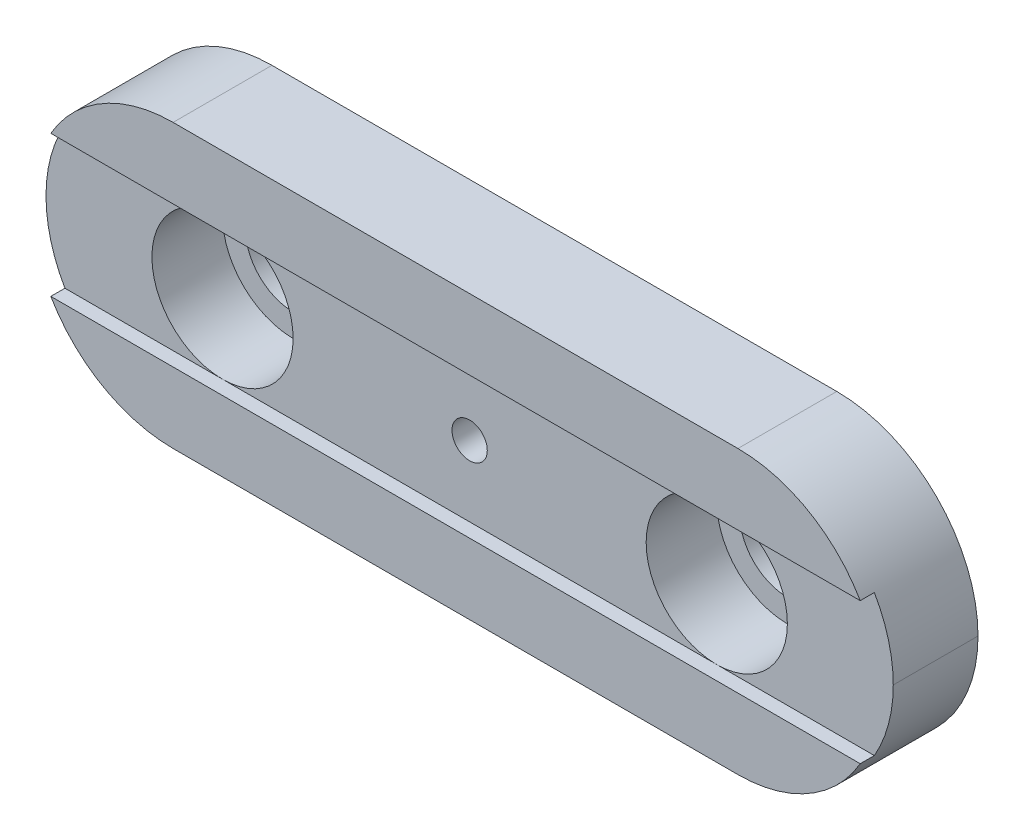
ISO-10303-21;
HEADER;
FILE_DESCRIPTION(('STEP AP214'),'2;1');
FILE_NAME('part.step','',(''),(''),'','','');
FILE_SCHEMA(('AUTOMOTIVE_DESIGN { 1 0 10303 214 1 1 1 1 }'));
ENDSEC;
DATA;
#1=APPLICATION_CONTEXT('core data for automotive mechanical design processes');
#2=APPLICATION_PROTOCOL_DEFINITION('international standard','automotive_design',2000,#1);
#3=PRODUCT_CONTEXT('',#1,'mechanical');
#4=PRODUCT('Part','Part','',(#3));
#5=PRODUCT_RELATED_PRODUCT_CATEGORY('part','',(#4));
#6=PRODUCT_DEFINITION_FORMATION('','',#4);
#7=PRODUCT_DEFINITION_CONTEXT('part definition',#1,'design');
#8=PRODUCT_DEFINITION('design','',#6,#7);
#9=PRODUCT_DEFINITION_SHAPE('','',#8);
#10=(LENGTH_UNIT() NAMED_UNIT(*) SI_UNIT(.MILLI.,.METRE.));
#11=(NAMED_UNIT(*) PLANE_ANGLE_UNIT() SI_UNIT($,.RADIAN.));
#12=(NAMED_UNIT(*) SI_UNIT($,.STERADIAN.) SOLID_ANGLE_UNIT());
#13=UNCERTAINTY_MEASURE_WITH_UNIT(LENGTH_MEASURE(1.E-05),#10,'distance_accuracy_value','');
#14=(GEOMETRIC_REPRESENTATION_CONTEXT(3) GLOBAL_UNCERTAINTY_ASSIGNED_CONTEXT((#13)) GLOBAL_UNIT_ASSIGNED_CONTEXT((#10,
#11,#12)) REPRESENTATION_CONTEXT('',''));
#15=CARTESIAN_POINT('',(0.,0.,0.));
#16=DIRECTION('',(0.,0.,1.));
#17=DIRECTION('',(1.,0.,0.));
#18=AXIS2_PLACEMENT_3D('',#15,#16,#17);
#19=CARTESIAN_POINT('',(60.,10.,12.));
#20=DIRECTION('',(0.,0.,-1.));
#21=DIRECTION('',(-1.,0.,0.));
#22=AXIS2_PLACEMENT_3D('',#19,#20,#21);
#23=PLANE('',#22);
#24=CARTESIAN_POINT('',(0.,0.,12.));
#25=DIRECTION('',(0.,0.,1.));
#26=DIRECTION('',(1.,0.,0.));
#27=AXIS2_PLACEMENT_3D('',#24,#25,#26);
#28=CIRCLE('',#27,2.49999999999999);
#29=CARTESIAN_POINT('',(2.49999999999999,0.,12.));
#30=VERTEX_POINT('',#29);
#31=EDGE_CURVE('E219',#30,#30,#28,.T.);
#32=ORIENTED_EDGE('',*,*,#31,.F.);
#33=EDGE_LOOP('',(#32));
#34=FACE_BOUND('',#33,.T.);
#35=CARTESIAN_POINT('',(-35.,0.,12.));
#36=DIRECTION('',(0.,0.,1.));
#37=DIRECTION('',(1.,0.,0.));
#38=AXIS2_PLACEMENT_3D('',#35,#36,#37);
#39=CIRCLE('',#38,10.);
#40=CARTESIAN_POINT('',(-35.,-10.,12.));
#41=VERTEX_POINT('',#40);
#42=CARTESIAN_POINT('',(-35.,10.,12.));
#43=VERTEX_POINT('',#42);
#44=EDGE_CURVE('E122',#41,#43,#39,.T.);
#45=ORIENTED_EDGE('',*,*,#44,.F.);
#46=DIRECTION('',(1.,0.,0.));
#47=VECTOR('',#46,1.);
#48=CARTESIAN_POINT('',(-60.,-10.,12.));
#49=LINE('',#48,#47);
#50=CARTESIAN_POINT('',(35.,-10.,12.));
#51=VERTEX_POINT('',#50);
#52=EDGE_CURVE('E157',#41,#51,#49,.T.);
#53=ORIENTED_EDGE('',*,*,#52,.T.);
#54=CARTESIAN_POINT('',(35.,0.,12.));
#55=DIRECTION('',(0.,0.,1.));
#56=DIRECTION('',(1.,0.,0.));
#57=AXIS2_PLACEMENT_3D('',#54,#55,#56);
#58=CIRCLE('',#57,10.);
#59=CARTESIAN_POINT('',(35.,10.,12.));
#60=VERTEX_POINT('',#59);
#61=EDGE_CURVE('E149',#60,#51,#58,.T.);
#62=ORIENTED_EDGE('',*,*,#61,.F.);
#63=DIRECTION('',(-1.,0.,0.));
#64=VECTOR('',#63,1.);
#65=CARTESIAN_POINT('',(-60.,10.,12.));
#66=LINE('',#65,#64);
#67=EDGE_CURVE('E140',#60,#43,#66,.T.);
#68=ORIENTED_EDGE('',*,*,#67,.T.);
#69=EDGE_LOOP('',(#45,#53,#62,#68));
#70=FACE_BOUND('',#69,.T.);
#71=ADVANCED_FACE('F34',(#34,#70),#23,.F.);
#72=CARTESIAN_POINT('',(-40.,0.,12.));
#73=DIRECTION('',(0.,0.,-1.));
#74=DIRECTION('',(-1.,0.,0.));
#75=AXIS2_PLACEMENT_3D('',#72,#73,#74);
#76=CIRCLE('',#75,20.);
#77=CARTESIAN_POINT('',(-57.3205080756888,10.,12.));
#78=VERTEX_POINT('',#77);
#79=CARTESIAN_POINT('',(-60.,0.,12.));
#80=VERTEX_POINT('',#79);
#81=EDGE_CURVE('E43',#78,#80,#76,.F.);
#82=ORIENTED_EDGE('',*,*,#81,.T.);
#83=CARTESIAN_POINT('',(-40.,0.,12.));
#84=DIRECTION('',(0.,0.,-1.));
#85=DIRECTION('',(-1.,0.,0.));
#86=AXIS2_PLACEMENT_3D('',#83,#84,#85);
#87=CIRCLE('',#86,20.);
#88=CARTESIAN_POINT('',(-57.3205080756888,-10.,12.));
#89=VERTEX_POINT('',#88);
#90=EDGE_CURVE('E11',#80,#89,#87,.F.);
#91=ORIENTED_EDGE('',*,*,#90,.T.);
#92=EDGE_CURVE('E134',#89,#41,#49,.T.);
#93=ORIENTED_EDGE('',*,*,#92,.T.);
#94=EDGE_CURVE('E125',#43,#41,#39,.T.);
#95=ORIENTED_EDGE('',*,*,#94,.F.);
#96=EDGE_CURVE('E133',#43,#78,#66,.T.);
#97=ORIENTED_EDGE('',*,*,#96,.T.);
#98=EDGE_LOOP('',(#82,#91,#93,#95,#97));
#99=FACE_BOUND('',#98,.T.);
#100=ADVANCED_FACE('F132',(#99),#23,.F.);
#101=CARTESIAN_POINT('',(40.,0.,12.));
#102=DIRECTION('',(0.,0.,-1.));
#103=DIRECTION('',(-1.,0.,0.));
#104=AXIS2_PLACEMENT_3D('',#101,#102,#103);
#105=CIRCLE('',#104,20.);
#106=CARTESIAN_POINT('',(57.3205080756888,-10.,12.));
#107=VERTEX_POINT('',#106);
#108=CARTESIAN_POINT('',(60.,0.,12.));
#109=VERTEX_POINT('',#108);
#110=EDGE_CURVE('E187',#107,#109,#105,.F.);
#111=ORIENTED_EDGE('',*,*,#110,.T.);
#112=CARTESIAN_POINT('',(40.,0.,12.));
#113=DIRECTION('',(0.,0.,-1.));
#114=DIRECTION('',(-1.,0.,0.));
#115=AXIS2_PLACEMENT_3D('',#112,#113,#114);
#116=CIRCLE('',#115,20.);
#117=CARTESIAN_POINT('',(57.3205080756888,10.,12.));
#118=VERTEX_POINT('',#117);
#119=EDGE_CURVE('E189',#109,#118,#116,.F.);
#120=ORIENTED_EDGE('',*,*,#119,.T.);
#121=EDGE_CURVE('E146',#118,#60,#66,.T.);
#122=ORIENTED_EDGE('',*,*,#121,.T.);
#123=EDGE_CURVE('E169',#51,#60,#58,.T.);
#124=ORIENTED_EDGE('',*,*,#123,.F.);
#125=EDGE_CURVE('E150',#51,#107,#49,.T.);
#126=ORIENTED_EDGE('',*,*,#125,.T.);
#127=EDGE_LOOP('',(#111,#120,#122,#124,#126));
#128=FACE_BOUND('',#127,.T.);
#129=ADVANCED_FACE('F263',(#128),#23,.F.);
#130=CARTESIAN_POINT('',(60.,20.,14.));
#131=DIRECTION('',(0.,0.,-1.));
#132=DIRECTION('',(-1.,0.,0.));
#133=AXIS2_PLACEMENT_3D('',#130,#131,#132);
#134=PLANE('',#133);
#135=DIRECTION('',(1.,0.,0.));
#136=VECTOR('',#135,1.);
#137=CARTESIAN_POINT('',(-60.,-20.,14.));
#138=LINE('',#137,#136);
#139=CARTESIAN_POINT('',(-40.,-20.,14.));
#140=VERTEX_POINT('',#139);
#141=CARTESIAN_POINT('',(40.,-20.,14.));
#142=VERTEX_POINT('',#141);
#143=EDGE_CURVE('E165',#140,#142,#138,.T.);
#144=ORIENTED_EDGE('',*,*,#143,.T.);
#145=CARTESIAN_POINT('',(40.,0.,14.));
#146=DIRECTION('',(0.,0.,-1.));
#147=DIRECTION('',(-1.,0.,0.));
#148=AXIS2_PLACEMENT_3D('',#145,#146,#147);
#149=CIRCLE('',#148,20.);
#150=CARTESIAN_POINT('',(57.3205080756888,-10.,14.));
#151=VERTEX_POINT('',#150);
#152=EDGE_CURVE('E205',#142,#151,#149,.F.);
#153=ORIENTED_EDGE('',*,*,#152,.T.);
#154=DIRECTION('',(1.,0.,0.));
#155=VECTOR('',#154,1.);
#156=CARTESIAN_POINT('',(-60.,-10.,14.));
#157=LINE('',#156,#155);
#158=CARTESIAN_POINT('',(-57.3205080756888,-10.,14.));
#159=VERTEX_POINT('',#158);
#160=EDGE_CURVE('E144',#159,#151,#157,.T.);
#161=ORIENTED_EDGE('',*,*,#160,.F.);
#162=CARTESIAN_POINT('',(-40.,0.,14.));
#163=DIRECTION('',(0.,0.,-1.));
#164=DIRECTION('',(-1.,0.,0.));
#165=AXIS2_PLACEMENT_3D('',#162,#163,#164);
#166=CIRCLE('',#165,20.);
#167=EDGE_CURVE('E203',#159,#140,#166,.F.);
#168=ORIENTED_EDGE('',*,*,#167,.T.);
#169=EDGE_LOOP('',(#144,#153,#161,#168));
#170=FACE_BOUND('',#169,.T.);
#171=ADVANCED_FACE('F270',(#170),#134,.F.);
#172=CARTESIAN_POINT('',(-60.,20.,14.));
#173=DIRECTION('',(0.,-1.,0.));
#174=DIRECTION('',(0.,0.,-1.));
#175=AXIS2_PLACEMENT_3D('',#172,#173,#174);
#176=PLANE('',#175);
#177=DIRECTION('',(-1.,0.,0.));
#178=VECTOR('',#177,1.);
#179=CARTESIAN_POINT('',(-60.,20.,14.));
#180=LINE('',#179,#178);
#181=CARTESIAN_POINT('',(40.,20.,14.));
#182=VERTEX_POINT('',#181);
#183=CARTESIAN_POINT('',(-40.,20.,14.));
#184=VERTEX_POINT('',#183);
#185=EDGE_CURVE('E162',#182,#184,#180,.T.);
#186=ORIENTED_EDGE('',*,*,#185,.F.);
#187=DIRECTION('',(0.,0.,-1.));
#188=VECTOR('',#187,1.);
#189=CARTESIAN_POINT('',(40.,20.,14.));
#190=LINE('',#189,#188);
#191=CARTESIAN_POINT('',(40.,20.,0.));
#192=VERTEX_POINT('',#191);
#193=EDGE_CURVE('E176',#182,#192,#190,.T.);
#194=ORIENTED_EDGE('',*,*,#193,.T.);
#195=DIRECTION('',(-1.,0.,0.));
#196=VECTOR('',#195,1.);
#197=CARTESIAN_POINT('',(-60.,20.,0.));
#198=LINE('',#197,#196);
#199=CARTESIAN_POINT('',(-40.,20.,0.));
#200=VERTEX_POINT('',#199);
#201=EDGE_CURVE('E156',#192,#200,#198,.T.);
#202=ORIENTED_EDGE('',*,*,#201,.T.);
#203=DIRECTION('',(0.,0.,-1.));
#204=VECTOR('',#203,1.);
#205=CARTESIAN_POINT('',(-40.,20.,14.));
#206=LINE('',#205,#204);
#207=EDGE_CURVE('E174',#200,#184,#206,.F.);
#208=ORIENTED_EDGE('',*,*,#207,.T.);
#209=EDGE_LOOP('',(#186,#194,#202,#208));
#210=FACE_BOUND('',#209,.T.);
#211=ADVANCED_FACE('F275',(#210),#176,.F.);
#212=CARTESIAN_POINT('',(-60.,-20.,14.));
#213=DIRECTION('',(0.,1.,0.));
#214=DIRECTION('',(0.,0.,1.));
#215=AXIS2_PLACEMENT_3D('',#212,#213,#214);
#216=PLANE('',#215);
#217=DIRECTION('',(1.,0.,0.));
#218=VECTOR('',#217,1.);
#219=CARTESIAN_POINT('',(-60.,-20.,0.));
#220=LINE('',#219,#218);
#221=CARTESIAN_POINT('',(-40.,-20.,0.));
#222=VERTEX_POINT('',#221);
#223=CARTESIAN_POINT('',(40.,-20.,0.));
#224=VERTEX_POINT('',#223);
#225=EDGE_CURVE('E166',#222,#224,#220,.T.);
#226=ORIENTED_EDGE('',*,*,#225,.T.);
#227=DIRECTION('',(0.,0.,-1.));
#228=VECTOR('',#227,1.);
#229=CARTESIAN_POINT('',(40.,-20.,14.));
#230=LINE('',#229,#228);
#231=EDGE_CURVE('E201',#224,#142,#230,.F.);
#232=ORIENTED_EDGE('',*,*,#231,.T.);
#233=ORIENTED_EDGE('',*,*,#143,.F.);
#234=DIRECTION('',(0.,0.,-1.));
#235=VECTOR('',#234,1.);
#236=CARTESIAN_POINT('',(-40.,-20.,14.));
#237=LINE('',#236,#235);
#238=EDGE_CURVE('E198',#140,#222,#237,.T.);
#239=ORIENTED_EDGE('',*,*,#238,.T.);
#240=EDGE_LOOP('',(#226,#232,#233,#239));
#241=FACE_BOUND('',#240,.T.);
#242=ADVANCED_FACE('F344',(#241),#216,.F.);
#243=DIRECTION('',(-1.,0.,0.));
#244=VECTOR('',#243,1.);
#245=CARTESIAN_POINT('',(-60.,10.,14.));
#246=LINE('',#245,#244);
#247=CARTESIAN_POINT('',(57.3205080756888,10.,14.));
#248=VERTEX_POINT('',#247);
#249=CARTESIAN_POINT('',(-57.3205080756888,10.,14.));
#250=VERTEX_POINT('',#249);
#251=EDGE_CURVE('E158',#248,#250,#246,.T.);
#252=ORIENTED_EDGE('',*,*,#251,.F.);
#253=CARTESIAN_POINT('',(40.,0.,14.));
#254=DIRECTION('',(0.,0.,-1.));
#255=DIRECTION('',(-1.,0.,0.));
#256=AXIS2_PLACEMENT_3D('',#253,#254,#255);
#257=CIRCLE('',#256,20.);
#258=EDGE_CURVE('E196',#248,#182,#257,.F.);
#259=ORIENTED_EDGE('',*,*,#258,.T.);
#260=ORIENTED_EDGE('',*,*,#185,.T.);
#261=CARTESIAN_POINT('',(-40.,0.,14.));
#262=DIRECTION('',(0.,0.,-1.));
#263=DIRECTION('',(-1.,0.,0.));
#264=AXIS2_PLACEMENT_3D('',#261,#262,#263);
#265=CIRCLE('',#264,20.);
#266=EDGE_CURVE('E194',#184,#250,#265,.F.);
#267=ORIENTED_EDGE('',*,*,#266,.T.);
#268=EDGE_LOOP('',(#252,#259,#260,#267));
#269=FACE_BOUND('',#268,.T.);
#270=ADVANCED_FACE('F278',(#269),#134,.F.);
#271=CARTESIAN_POINT('',(60.,20.,0.));
#272=DIRECTION('',(0.,0.,-1.));
#273=DIRECTION('',(-1.,0.,0.));
#274=AXIS2_PLACEMENT_3D('',#271,#272,#273);
#275=PLANE('',#274);
#276=CARTESIAN_POINT('',(0.,0.,0.));
#277=DIRECTION('',(0.,0.,1.));
#278=DIRECTION('',(1.,0.,0.));
#279=AXIS2_PLACEMENT_3D('',#276,#277,#278);
#280=CIRCLE('',#279,2.5);
#281=CARTESIAN_POINT('',(2.5,0.,0.));
#282=VERTEX_POINT('',#281);
#283=EDGE_CURVE('E216',#282,#282,#280,.T.);
#284=ORIENTED_EDGE('',*,*,#283,.T.);
#285=EDGE_LOOP('',(#284));
#286=FACE_BOUND('',#285,.T.);
#287=CARTESIAN_POINT('',(-35.,0.,0.));
#288=DIRECTION('',(0.,0.,1.));
#289=DIRECTION('',(1.,0.,0.));
#290=AXIS2_PLACEMENT_3D('',#287,#288,#289);
#291=CIRCLE('',#290,6.75);
#292=CARTESIAN_POINT('',(-28.25,0.,0.));
#293=VERTEX_POINT('',#292);
#294=EDGE_CURVE('E231',#293,#293,#291,.T.);
#295=ORIENTED_EDGE('',*,*,#294,.T.);
#296=EDGE_LOOP('',(#295));
#297=FACE_BOUND('',#296,.T.);
#298=CARTESIAN_POINT('',(35.,0.,0.));
#299=DIRECTION('',(0.,0.,1.));
#300=DIRECTION('',(1.,0.,0.));
#301=AXIS2_PLACEMENT_3D('',#298,#299,#300);
#302=CIRCLE('',#301,6.75);
#303=CARTESIAN_POINT('',(41.75,0.,0.));
#304=VERTEX_POINT('',#303);
#305=EDGE_CURVE('E153',#304,#304,#302,.T.);
#306=ORIENTED_EDGE('',*,*,#305,.T.);
#307=EDGE_LOOP('',(#306));
#308=FACE_BOUND('',#307,.T.);
#309=ORIENTED_EDGE('',*,*,#201,.F.);
#310=CARTESIAN_POINT('',(40.,0.,0.));
#311=DIRECTION('',(0.,0.,-1.));
#312=DIRECTION('',(-1.,0.,0.));
#313=AXIS2_PLACEMENT_3D('',#310,#311,#312);
#314=CIRCLE('',#313,20.);
#315=CARTESIAN_POINT('',(60.,0.,0.));
#316=VERTEX_POINT('',#315);
#317=EDGE_CURVE('E185',#192,#316,#314,.T.);
#318=ORIENTED_EDGE('',*,*,#317,.T.);
#319=CARTESIAN_POINT('',(40.,0.,0.));
#320=DIRECTION('',(0.,0.,-1.));
#321=DIRECTION('',(-1.,0.,0.));
#322=AXIS2_PLACEMENT_3D('',#319,#320,#321);
#323=CIRCLE('',#322,20.);
#324=EDGE_CURVE('E183',#316,#224,#323,.T.);
#325=ORIENTED_EDGE('',*,*,#324,.T.);
#326=ORIENTED_EDGE('',*,*,#225,.F.);
#327=CARTESIAN_POINT('',(-40.,0.,0.));
#328=DIRECTION('',(0.,0.,-1.));
#329=DIRECTION('',(-1.,0.,0.));
#330=AXIS2_PLACEMENT_3D('',#327,#328,#329);
#331=CIRCLE('',#330,20.);
#332=CARTESIAN_POINT('',(-60.,0.,0.));
#333=VERTEX_POINT('',#332);
#334=EDGE_CURVE('E181',#222,#333,#331,.T.);
#335=ORIENTED_EDGE('',*,*,#334,.T.);
#336=CARTESIAN_POINT('',(-40.,0.,0.));
#337=DIRECTION('',(0.,0.,-1.));
#338=DIRECTION('',(-1.,0.,0.));
#339=AXIS2_PLACEMENT_3D('',#336,#337,#338);
#340=CIRCLE('',#339,20.);
#341=EDGE_CURVE('E179',#333,#200,#340,.T.);
#342=ORIENTED_EDGE('',*,*,#341,.T.);
#343=EDGE_LOOP('',(#309,#318,#325,#326,#335,#342));
#344=FACE_BOUND('',#343,.T.);
#345=ADVANCED_FACE('F244',(#286,#297,#308,#344),#275,.T.);
#346=CARTESIAN_POINT('',(-60.,-10.,12.));
#347=DIRECTION('',(0.,-1.,0.));
#348=DIRECTION('',(0.,0.,-1.));
#349=AXIS2_PLACEMENT_3D('',#346,#347,#348);
#350=PLANE('',#349);
#351=ORIENTED_EDGE('',*,*,#160,.T.);
#352=DIRECTION('',(0.,0.,-1.));
#353=VECTOR('',#352,1.);
#354=CARTESIAN_POINT('',(57.3205080756888,-10.,14.));
#355=LINE('',#354,#353);
#356=EDGE_CURVE('E209',#151,#107,#355,.T.);
#357=ORIENTED_EDGE('',*,*,#356,.T.);
#358=ORIENTED_EDGE('',*,*,#125,.F.);
#359=ORIENTED_EDGE('',*,*,#52,.F.);
#360=ORIENTED_EDGE('',*,*,#92,.F.);
#361=DIRECTION('',(0.,0.,-1.));
#362=VECTOR('',#361,1.);
#363=CARTESIAN_POINT('',(-57.3205080756888,-10.,12.));
#364=LINE('',#363,#362);
#365=EDGE_CURVE('E207',#89,#159,#364,.F.);
#366=ORIENTED_EDGE('',*,*,#365,.T.);
#367=EDGE_LOOP('',(#351,#357,#358,#359,#360,#366));
#368=FACE_BOUND('',#367,.T.);
#369=ADVANCED_FACE('F258',(#368),#350,.F.);
#370=CARTESIAN_POINT('',(-60.,10.,12.));
#371=DIRECTION('',(0.,1.,0.));
#372=DIRECTION('',(0.,0.,1.));
#373=AXIS2_PLACEMENT_3D('',#370,#371,#372);
#374=PLANE('',#373);
#375=ORIENTED_EDGE('',*,*,#121,.F.);
#376=DIRECTION('',(0.,0.,-1.));
#377=VECTOR('',#376,1.);
#378=CARTESIAN_POINT('',(57.3205080756888,10.,12.));
#379=LINE('',#378,#377);
#380=EDGE_CURVE('E192',#118,#248,#379,.F.);
#381=ORIENTED_EDGE('',*,*,#380,.T.);
#382=ORIENTED_EDGE('',*,*,#251,.T.);
#383=DIRECTION('',(0.,0.,-1.));
#384=VECTOR('',#383,1.);
#385=CARTESIAN_POINT('',(-57.3205080756888,10.,14.));
#386=LINE('',#385,#384);
#387=EDGE_CURVE('E143',#250,#78,#386,.T.);
#388=ORIENTED_EDGE('',*,*,#387,.T.);
#389=ORIENTED_EDGE('',*,*,#96,.F.);
#390=ORIENTED_EDGE('',*,*,#67,.F.);
#391=EDGE_LOOP('',(#375,#381,#382,#388,#389,#390));
#392=FACE_BOUND('',#391,.T.);
#393=ADVANCED_FACE('F139',(#392),#374,.F.);
#394=CARTESIAN_POINT('',(35.,0.,12.));
#395=DIRECTION('',(0.,0.,1.));
#396=DIRECTION('',(1.,0.,0.));
#397=AXIS2_PLACEMENT_3D('',#394,#395,#396);
#398=CYLINDRICAL_SURFACE('',#397,6.75);
#399=ORIENTED_EDGE('',*,*,#305,.F.);
#400=EDGE_LOOP('',(#399));
#401=FACE_BOUND('',#400,.T.);
#402=CARTESIAN_POINT('',(35.,0.,2.));
#403=DIRECTION('',(0.,0.,1.));
#404=DIRECTION('',(1.,0.,0.));
#405=AXIS2_PLACEMENT_3D('',#402,#403,#404);
#406=CIRCLE('',#405,6.75);
#407=CARTESIAN_POINT('',(41.75,0.,2.));
#408=VERTEX_POINT('',#407);
#409=EDGE_CURVE('E237',#408,#408,#406,.T.);
#410=ORIENTED_EDGE('',*,*,#409,.T.);
#411=EDGE_LOOP('',(#410));
#412=FACE_BOUND('',#411,.T.);
#413=ADVANCED_FACE('F247',(#401,#412),#398,.F.);
#414=CARTESIAN_POINT('',(41.75,0.,2.));
#415=DIRECTION('',(0.,0.,-1.));
#416=DIRECTION('',(-1.,0.,0.));
#417=AXIS2_PLACEMENT_3D('',#414,#415,#416);
#418=PLANE('',#417);
#419=ORIENTED_EDGE('',*,*,#409,.F.);
#420=EDGE_LOOP('',(#419));
#421=FACE_BOUND('',#420,.T.);
#422=CARTESIAN_POINT('',(35.,0.,2.));
#423=DIRECTION('',(0.,0.,1.));
#424=DIRECTION('',(1.,0.,0.));
#425=AXIS2_PLACEMENT_3D('',#422,#423,#424);
#426=CIRCLE('',#425,9.99999999999999);
#427=CARTESIAN_POINT('',(45.,0.,2.));
#428=VERTEX_POINT('',#427);
#429=EDGE_CURVE('E235',#428,#428,#426,.T.);
#430=ORIENTED_EDGE('',*,*,#429,.T.);
#431=EDGE_LOOP('',(#430));
#432=FACE_BOUND('',#431,.T.);
#433=ADVANCED_FACE('F249',(#421,#432),#418,.F.);
#434=CARTESIAN_POINT('',(35.,0.,12.));
#435=DIRECTION('',(0.,0.,1.));
#436=DIRECTION('',(1.,0.,0.));
#437=AXIS2_PLACEMENT_3D('',#434,#435,#436);
#438=CYLINDRICAL_SURFACE('',#437,10.);
#439=ORIENTED_EDGE('',*,*,#429,.F.);
#440=EDGE_LOOP('',(#439));
#441=FACE_BOUND('',#440,.T.);
#442=ORIENTED_EDGE('',*,*,#61,.T.);
#443=ORIENTED_EDGE('',*,*,#123,.T.);
#444=EDGE_LOOP('',(#442,#443));
#445=FACE_BOUND('',#444,.T.);
#446=ADVANCED_FACE('F255',(#441,#445),#438,.F.);
#447=CARTESIAN_POINT('',(-35.,0.,12.));
#448=DIRECTION('',(0.,0.,1.));
#449=DIRECTION('',(1.,0.,0.));
#450=AXIS2_PLACEMENT_3D('',#447,#448,#449);
#451=CYLINDRICAL_SURFACE('',#450,6.75);
#452=ORIENTED_EDGE('',*,*,#294,.F.);
#453=EDGE_LOOP('',(#452));
#454=FACE_BOUND('',#453,.T.);
#455=CARTESIAN_POINT('',(-35.,0.,2.));
#456=DIRECTION('',(0.,0.,1.));
#457=DIRECTION('',(1.,0.,0.));
#458=AXIS2_PLACEMENT_3D('',#455,#456,#457);
#459=CIRCLE('',#458,6.75);
#460=CARTESIAN_POINT('',(-28.25,0.,2.));
#461=VERTEX_POINT('',#460);
#462=EDGE_CURVE('E228',#461,#461,#459,.T.);
#463=ORIENTED_EDGE('',*,*,#462,.T.);
#464=EDGE_LOOP('',(#463));
#465=FACE_BOUND('',#464,.T.);
#466=ADVANCED_FACE('F310',(#454,#465),#451,.F.);
#467=CARTESIAN_POINT('',(-28.25,0.,2.));
#468=DIRECTION('',(0.,0.,-1.));
#469=DIRECTION('',(-1.,0.,0.));
#470=AXIS2_PLACEMENT_3D('',#467,#468,#469);
#471=PLANE('',#470);
#472=ORIENTED_EDGE('',*,*,#462,.F.);
#473=EDGE_LOOP('',(#472));
#474=FACE_BOUND('',#473,.T.);
#475=CARTESIAN_POINT('',(-35.,0.,2.));
#476=DIRECTION('',(0.,0.,1.));
#477=DIRECTION('',(1.,0.,0.));
#478=AXIS2_PLACEMENT_3D('',#475,#476,#477);
#479=CIRCLE('',#478,10.);
#480=CARTESIAN_POINT('',(-25.,0.,2.));
#481=VERTEX_POINT('',#480);
#482=EDGE_CURVE('E135',#481,#481,#479,.T.);
#483=ORIENTED_EDGE('',*,*,#482,.T.);
#484=EDGE_LOOP('',(#483));
#485=FACE_BOUND('',#484,.T.);
#486=ADVANCED_FACE('F316',(#474,#485),#471,.F.);
#487=CARTESIAN_POINT('',(-35.,0.,12.));
#488=DIRECTION('',(0.,0.,1.));
#489=DIRECTION('',(1.,0.,0.));
#490=AXIS2_PLACEMENT_3D('',#487,#488,#489);
#491=CYLINDRICAL_SURFACE('',#490,10.);
#492=ORIENTED_EDGE('',*,*,#482,.F.);
#493=EDGE_LOOP('',(#492));
#494=FACE_BOUND('',#493,.T.);
#495=ORIENTED_EDGE('',*,*,#94,.T.);
#496=ORIENTED_EDGE('',*,*,#44,.T.);
#497=EDGE_LOOP('',(#495,#496));
#498=FACE_BOUND('',#497,.T.);
#499=ADVANCED_FACE('F124',(#494,#498),#491,.F.);
#500=CARTESIAN_POINT('',(40.,0.,14.));
#501=DIRECTION('',(0.,0.,-1.));
#502=DIRECTION('',(-1.,0.,0.));
#503=AXIS2_PLACEMENT_3D('',#500,#501,#502);
#504=CYLINDRICAL_SURFACE('',#503,20.);
#505=DIRECTION('',(0.,0.,-1.));
#506=VECTOR('',#505,1.);
#507=CARTESIAN_POINT('',(60.,0.,14.));
#508=LINE('',#507,#506);
#509=EDGE_CURVE('E129',#109,#316,#508,.T.);
#510=ORIENTED_EDGE('',*,*,#509,.F.);
#511=ORIENTED_EDGE('',*,*,#110,.F.);
#512=ORIENTED_EDGE('',*,*,#356,.F.);
#513=ORIENTED_EDGE('',*,*,#152,.F.);
#514=ORIENTED_EDGE('',*,*,#231,.F.);
#515=ORIENTED_EDGE('',*,*,#324,.F.);
#516=EDGE_LOOP('',(#510,#511,#512,#513,#514,#515));
#517=FACE_BOUND('',#516,.T.);
#518=ADVANCED_FACE('F286',(#517),#504,.T.);
#519=CARTESIAN_POINT('',(40.,0.,14.));
#520=DIRECTION('',(0.,0.,-1.));
#521=DIRECTION('',(-1.,0.,0.));
#522=AXIS2_PLACEMENT_3D('',#519,#520,#521);
#523=CYLINDRICAL_SURFACE('',#522,20.);
#524=ORIENTED_EDGE('',*,*,#119,.F.);
#525=ORIENTED_EDGE('',*,*,#509,.T.);
#526=ORIENTED_EDGE('',*,*,#317,.F.);
#527=ORIENTED_EDGE('',*,*,#193,.F.);
#528=ORIENTED_EDGE('',*,*,#258,.F.);
#529=ORIENTED_EDGE('',*,*,#380,.F.);
#530=EDGE_LOOP('',(#524,#525,#526,#527,#528,#529));
#531=FACE_BOUND('',#530,.T.);
#532=ADVANCED_FACE('F289',(#531),#523,.T.);
#533=CARTESIAN_POINT('',(-40.,0.,14.));
#534=DIRECTION('',(0.,0.,-1.));
#535=DIRECTION('',(-1.,0.,0.));
#536=AXIS2_PLACEMENT_3D('',#533,#534,#535);
#537=CYLINDRICAL_SURFACE('',#536,20.);
#538=DIRECTION('',(0.,0.,-1.));
#539=VECTOR('',#538,1.);
#540=CARTESIAN_POINT('',(-60.,0.,14.));
#541=LINE('',#540,#539);
#542=EDGE_CURVE('E38',#80,#333,#541,.T.);
#543=ORIENTED_EDGE('',*,*,#542,.F.);
#544=ORIENTED_EDGE('',*,*,#81,.F.);
#545=ORIENTED_EDGE('',*,*,#387,.F.);
#546=ORIENTED_EDGE('',*,*,#266,.F.);
#547=ORIENTED_EDGE('',*,*,#207,.F.);
#548=ORIENTED_EDGE('',*,*,#341,.F.);
#549=EDGE_LOOP('',(#543,#544,#545,#546,#547,#548));
#550=FACE_BOUND('',#549,.T.);
#551=ADVANCED_FACE('F36',(#550),#537,.T.);
#552=CARTESIAN_POINT('',(-40.,0.,14.));
#553=DIRECTION('',(0.,0.,-1.));
#554=DIRECTION('',(-1.,0.,0.));
#555=AXIS2_PLACEMENT_3D('',#552,#553,#554);
#556=CYLINDRICAL_SURFACE('',#555,20.);
#557=ORIENTED_EDGE('',*,*,#90,.F.);
#558=ORIENTED_EDGE('',*,*,#542,.T.);
#559=ORIENTED_EDGE('',*,*,#334,.F.);
#560=ORIENTED_EDGE('',*,*,#238,.F.);
#561=ORIENTED_EDGE('',*,*,#167,.F.);
#562=ORIENTED_EDGE('',*,*,#365,.F.);
#563=EDGE_LOOP('',(#557,#558,#559,#560,#561,#562));
#564=FACE_BOUND('',#563,.T.);
#565=ADVANCED_FACE('F300',(#564),#556,.T.);
#566=CARTESIAN_POINT('',(0.,0.,12.));
#567=DIRECTION('',(0.,0.,1.));
#568=DIRECTION('',(1.,0.,0.));
#569=AXIS2_PLACEMENT_3D('',#566,#567,#568);
#570=CYLINDRICAL_SURFACE('',#569,2.49999999999999);
#571=ORIENTED_EDGE('',*,*,#283,.F.);
#572=EDGE_LOOP('',(#571));
#573=FACE_BOUND('',#572,.T.);
#574=ORIENTED_EDGE('',*,*,#31,.T.);
#575=EDGE_LOOP('',(#574));
#576=FACE_BOUND('',#575,.T.);
#577=ADVANCED_FACE('F327',(#573,#576),#570,.F.);
#578=CLOSED_SHELL('',(#71,#100,#129,#171,#211,#242,#270,#345,#369,#393,#413,#433,#446,#466,#486,
#499,#518,#532,#551,#565,#577));
#579=MANIFOLD_SOLID_BREP('B2',#578);
#580=ADVANCED_BREP_SHAPE_REPRESENTATION('',(#18,#579),#14);
#581=SHAPE_DEFINITION_REPRESENTATION(#9,#580);
ENDSEC;
END-ISO-10303-21;
